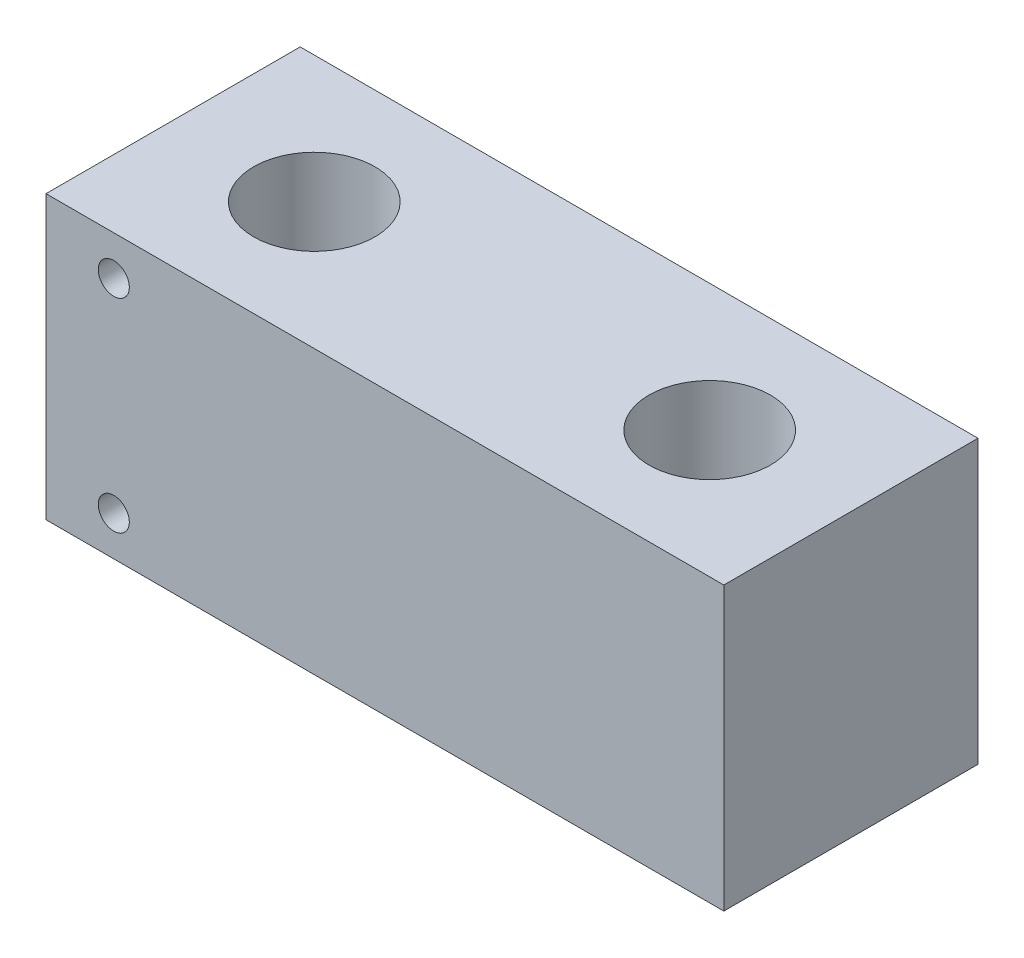
ISO-10303-21;
HEADER;
FILE_DESCRIPTION(('STEP AP214'),'2;1');
FILE_NAME('part.step','',(''),(''),'','','');
FILE_SCHEMA(('AUTOMOTIVE_DESIGN { 1 0 10303 214 1 1 1 1 }'));
ENDSEC;
DATA;
#1=APPLICATION_CONTEXT('core data for automotive mechanical design processes');
#2=APPLICATION_PROTOCOL_DEFINITION('international standard','automotive_design',2000,#1);
#3=PRODUCT_CONTEXT('',#1,'mechanical');
#4=PRODUCT('Part','Part','',(#3));
#5=PRODUCT_RELATED_PRODUCT_CATEGORY('part','',(#4));
#6=PRODUCT_DEFINITION_FORMATION('','',#4);
#7=PRODUCT_DEFINITION_CONTEXT('part definition',#1,'design');
#8=PRODUCT_DEFINITION('design','',#6,#7);
#9=PRODUCT_DEFINITION_SHAPE('','',#8);
#10=(LENGTH_UNIT() NAMED_UNIT(*) SI_UNIT(.MILLI.,.METRE.));
#11=(NAMED_UNIT(*) PLANE_ANGLE_UNIT() SI_UNIT($,.RADIAN.));
#12=(NAMED_UNIT(*) SI_UNIT($,.STERADIAN.) SOLID_ANGLE_UNIT());
#13=UNCERTAINTY_MEASURE_WITH_UNIT(LENGTH_MEASURE(1.E-05),#10,'distance_accuracy_value','');
#14=(GEOMETRIC_REPRESENTATION_CONTEXT(3) GLOBAL_UNCERTAINTY_ASSIGNED_CONTEXT((#13)) GLOBAL_UNIT_ASSIGNED_CONTEXT((#10,
#11,#12)) REPRESENTATION_CONTEXT('',''));
#15=CARTESIAN_POINT('',(0.,0.,0.));
#16=DIRECTION('',(0.,0.,1.));
#17=DIRECTION('',(1.,0.,0.));
#18=AXIS2_PLACEMENT_3D('',#15,#16,#17);
#19=CARTESIAN_POINT('',(0.,50.,0.));
#20=DIRECTION('',(0.,1.,0.));
#21=DIRECTION('',(0.,0.,1.));
#22=AXIS2_PLACEMENT_3D('',#19,#20,#21);
#23=PLANE('',#22);
#24=CARTESIAN_POINT('',(-35.,50.,0.));
#25=DIRECTION('',(0.,1.,0.));
#26=DIRECTION('',(0.,0.,1.));
#27=AXIS2_PLACEMENT_3D('',#24,#25,#26);
#28=CIRCLE('',#27,10.75);
#29=CARTESIAN_POINT('',(-35.,50.,10.75));
#30=VERTEX_POINT('',#29);
#31=EDGE_CURVE('E123',#30,#30,#28,.T.);
#32=ORIENTED_EDGE('',*,*,#31,.F.);
#33=EDGE_LOOP('',(#32));
#34=FACE_BOUND('',#33,.T.);
#35=DIRECTION('',(0.,0.,-1.));
#36=VECTOR('',#35,1.);
#37=CARTESIAN_POINT('',(60.,50.,-22.5));
#38=LINE('',#37,#36);
#39=CARTESIAN_POINT('',(60.,50.,22.5));
#40=VERTEX_POINT('',#39);
#41=CARTESIAN_POINT('',(60.,50.,-22.5));
#42=VERTEX_POINT('',#41);
#43=EDGE_CURVE('E129',#40,#42,#38,.T.);
#44=ORIENTED_EDGE('',*,*,#43,.T.);
#45=DIRECTION('',(-1.,0.,0.));
#46=VECTOR('',#45,1.);
#47=CARTESIAN_POINT('',(-60.,50.,-22.5));
#48=LINE('',#47,#46);
#49=CARTESIAN_POINT('',(-60.,50.,-22.5));
#50=VERTEX_POINT('',#49);
#51=EDGE_CURVE('E88',#42,#50,#48,.T.);
#52=ORIENTED_EDGE('',*,*,#51,.T.);
#53=DIRECTION('',(0.,0.,1.));
#54=VECTOR('',#53,1.);
#55=CARTESIAN_POINT('',(-60.,50.,-22.5));
#56=LINE('',#55,#54);
#57=CARTESIAN_POINT('',(-60.,50.,22.5));
#58=VERTEX_POINT('',#57);
#59=EDGE_CURVE('E132',#50,#58,#56,.T.);
#60=ORIENTED_EDGE('',*,*,#59,.T.);
#61=DIRECTION('',(1.,0.,0.));
#62=VECTOR('',#61,1.);
#63=CARTESIAN_POINT('',(-60.,50.,22.5));
#64=LINE('',#63,#62);
#65=EDGE_CURVE('E57',#58,#40,#64,.T.);
#66=ORIENTED_EDGE('',*,*,#65,.T.);
#67=EDGE_LOOP('',(#44,#52,#60,#66));
#68=FACE_BOUND('',#67,.T.);
#69=CARTESIAN_POINT('',(35.,50.,0.));
#70=DIRECTION('',(0.,1.,0.));
#71=DIRECTION('',(0.,0.,-1.));
#72=AXIS2_PLACEMENT_3D('',#69,#70,#71);
#73=CIRCLE('',#72,10.75);
#74=CARTESIAN_POINT('',(35.,50.,-10.75));
#75=VERTEX_POINT('',#74);
#76=EDGE_CURVE('E117',#75,#75,#73,.T.);
#77=ORIENTED_EDGE('',*,*,#76,.F.);
#78=EDGE_LOOP('',(#77));
#79=FACE_BOUND('',#78,.T.);
#80=ADVANCED_FACE('F40',(#34,#68,#79),#23,.T.);
#81=CARTESIAN_POINT('',(0.,0.,0.));
#82=DIRECTION('',(0.,1.,0.));
#83=DIRECTION('',(0.,0.,1.));
#84=AXIS2_PLACEMENT_3D('',#81,#82,#83);
#85=PLANE('',#84);
#86=DIRECTION('',(0.,0.,-1.));
#87=VECTOR('',#86,1.);
#88=CARTESIAN_POINT('',(60.,0.,-22.5));
#89=LINE('',#88,#87);
#90=CARTESIAN_POINT('',(60.,0.,22.5));
#91=VERTEX_POINT('',#90);
#92=CARTESIAN_POINT('',(60.,0.,-22.5));
#93=VERTEX_POINT('',#92);
#94=EDGE_CURVE('E126',#91,#93,#89,.T.);
#95=ORIENTED_EDGE('',*,*,#94,.F.);
#96=DIRECTION('',(1.,0.,0.));
#97=VECTOR('',#96,1.);
#98=CARTESIAN_POINT('',(-60.,0.,22.5));
#99=LINE('',#98,#97);
#100=CARTESIAN_POINT('',(-60.,0.,22.5));
#101=VERTEX_POINT('',#100);
#102=EDGE_CURVE('E81',#101,#91,#99,.T.);
#103=ORIENTED_EDGE('',*,*,#102,.F.);
#104=DIRECTION('',(0.,0.,1.));
#105=VECTOR('',#104,1.);
#106=CARTESIAN_POINT('',(-60.,0.,-22.5));
#107=LINE('',#106,#105);
#108=CARTESIAN_POINT('',(-60.,0.,-22.5));
#109=VERTEX_POINT('',#108);
#110=EDGE_CURVE('E75',#109,#101,#107,.T.);
#111=ORIENTED_EDGE('',*,*,#110,.F.);
#112=DIRECTION('',(-1.,0.,0.));
#113=VECTOR('',#112,1.);
#114=CARTESIAN_POINT('',(-60.,0.,-22.5));
#115=LINE('',#114,#113);
#116=EDGE_CURVE('E138',#93,#109,#115,.T.);
#117=ORIENTED_EDGE('',*,*,#116,.F.);
#118=EDGE_LOOP('',(#95,#103,#111,#117));
#119=FACE_BOUND('',#118,.T.);
#120=CARTESIAN_POINT('',(-35.,0.,0.));
#121=DIRECTION('',(0.,1.,0.));
#122=DIRECTION('',(0.,0.,1.));
#123=AXIS2_PLACEMENT_3D('',#120,#121,#122);
#124=CIRCLE('',#123,10.75);
#125=CARTESIAN_POINT('',(-35.,0.,10.75));
#126=VERTEX_POINT('',#125);
#127=EDGE_CURVE('E120',#126,#126,#124,.T.);
#128=ORIENTED_EDGE('',*,*,#127,.T.);
#129=EDGE_LOOP('',(#128));
#130=FACE_BOUND('',#129,.T.);
#131=CARTESIAN_POINT('',(35.,0.,0.));
#132=DIRECTION('',(0.,1.,0.));
#133=DIRECTION('',(0.,0.,-1.));
#134=AXIS2_PLACEMENT_3D('',#131,#132,#133);
#135=CIRCLE('',#134,10.75);
#136=CARTESIAN_POINT('',(35.,0.,-10.75));
#137=VERTEX_POINT('',#136);
#138=EDGE_CURVE('E116',#137,#137,#135,.T.);
#139=ORIENTED_EDGE('',*,*,#138,.T.);
#140=EDGE_LOOP('',(#139));
#141=FACE_BOUND('',#140,.T.);
#142=ADVANCED_FACE('F148',(#119,#130,#141),#85,.F.);
#143=CARTESIAN_POINT('',(60.,50.,-22.5));
#144=DIRECTION('',(-1.,0.,0.));
#145=DIRECTION('',(0.,0.,1.));
#146=AXIS2_PLACEMENT_3D('',#143,#144,#145);
#147=PLANE('',#146);
#148=ORIENTED_EDGE('',*,*,#94,.T.);
#149=DIRECTION('',(0.,-1.,0.));
#150=VECTOR('',#149,1.);
#151=CARTESIAN_POINT('',(60.,50.,-22.5));
#152=LINE('',#151,#150);
#153=EDGE_CURVE('E11',#42,#93,#152,.T.);
#154=ORIENTED_EDGE('',*,*,#153,.F.);
#155=ORIENTED_EDGE('',*,*,#43,.F.);
#156=DIRECTION('',(0.,-1.,0.));
#157=VECTOR('',#156,1.);
#158=CARTESIAN_POINT('',(60.,50.,22.5));
#159=LINE('',#158,#157);
#160=EDGE_CURVE('E135',#40,#91,#159,.T.);
#161=ORIENTED_EDGE('',*,*,#160,.T.);
#162=EDGE_LOOP('',(#148,#154,#155,#161));
#163=FACE_BOUND('',#162,.T.);
#164=ADVANCED_FACE('F42',(#163),#147,.F.);
#165=CARTESIAN_POINT('',(-60.,50.,-22.5));
#166=DIRECTION('',(0.,0.,1.));
#167=DIRECTION('',(1.,0.,0.));
#168=AXIS2_PLACEMENT_3D('',#165,#166,#167);
#169=PLANE('',#168);
#170=ORIENTED_EDGE('',*,*,#116,.T.);
#171=DIRECTION('',(0.,-1.,0.));
#172=VECTOR('',#171,1.);
#173=CARTESIAN_POINT('',(-60.,50.,-22.5));
#174=LINE('',#173,#172);
#175=EDGE_CURVE('E49',#50,#109,#174,.T.);
#176=ORIENTED_EDGE('',*,*,#175,.F.);
#177=ORIENTED_EDGE('',*,*,#51,.F.);
#178=ORIENTED_EDGE('',*,*,#153,.T.);
#179=EDGE_LOOP('',(#170,#176,#177,#178));
#180=FACE_BOUND('',#179,.T.);
#181=ADVANCED_FACE('F166',(#180),#169,.F.);
#182=CARTESIAN_POINT('',(-60.,50.,-22.5));
#183=DIRECTION('',(1.,0.,0.));
#184=DIRECTION('',(0.,0.,-1.));
#185=AXIS2_PLACEMENT_3D('',#182,#183,#184);
#186=PLANE('',#185);
#187=ORIENTED_EDGE('',*,*,#110,.T.);
#188=DIRECTION('',(0.,-1.,0.));
#189=VECTOR('',#188,1.);
#190=CARTESIAN_POINT('',(-60.,50.,22.5));
#191=LINE('',#190,#189);
#192=EDGE_CURVE('E143',#58,#101,#191,.T.);
#193=ORIENTED_EDGE('',*,*,#192,.F.);
#194=ORIENTED_EDGE('',*,*,#59,.F.);
#195=ORIENTED_EDGE('',*,*,#175,.T.);
#196=EDGE_LOOP('',(#187,#193,#194,#195));
#197=FACE_BOUND('',#196,.T.);
#198=ADVANCED_FACE('F145',(#197),#186,.F.);
#199=CARTESIAN_POINT('',(-60.,50.,22.5));
#200=DIRECTION('',(0.,0.,-1.));
#201=DIRECTION('',(-1.,0.,0.));
#202=AXIS2_PLACEMENT_3D('',#199,#200,#201);
#203=PLANE('',#202);
#204=CARTESIAN_POINT('',(-48.,43.,22.5));
#205=DIRECTION('',(0.,0.,1.));
#206=DIRECTION('',(1.,0.,0.));
#207=AXIS2_PLACEMENT_3D('',#204,#205,#206);
#208=CIRCLE('',#207,2.75);
#209=CARTESIAN_POINT('',(-45.25,43.,22.5));
#210=VERTEX_POINT('',#209);
#211=EDGE_CURVE('E106',#210,#210,#208,.T.);
#212=ORIENTED_EDGE('',*,*,#211,.F.);
#213=EDGE_LOOP('',(#212));
#214=FACE_BOUND('',#213,.T.);
#215=CARTESIAN_POINT('',(-48.,7.00000000000001,22.5));
#216=DIRECTION('',(0.,0.,1.));
#217=DIRECTION('',(1.,0.,0.));
#218=AXIS2_PLACEMENT_3D('',#215,#216,#217);
#219=CIRCLE('',#218,2.75);
#220=CARTESIAN_POINT('',(-45.25,7.00000000000001,22.5));
#221=VERTEX_POINT('',#220);
#222=EDGE_CURVE('E105',#221,#221,#219,.T.);
#223=ORIENTED_EDGE('',*,*,#222,.F.);
#224=EDGE_LOOP('',(#223));
#225=FACE_BOUND('',#224,.T.);
#226=ORIENTED_EDGE('',*,*,#102,.T.);
#227=ORIENTED_EDGE('',*,*,#160,.F.);
#228=ORIENTED_EDGE('',*,*,#65,.F.);
#229=ORIENTED_EDGE('',*,*,#192,.T.);
#230=EDGE_LOOP('',(#226,#227,#228,#229));
#231=FACE_BOUND('',#230,.T.);
#232=ADVANCED_FACE('F153',(#214,#225,#231),#203,.F.);
#233=CARTESIAN_POINT('',(-35.,50.,0.));
#234=DIRECTION('',(0.,-1.,0.));
#235=DIRECTION('',(0.,0.,-1.));
#236=AXIS2_PLACEMENT_3D('',#233,#234,#235);
#237=CYLINDRICAL_SURFACE('',#236,10.75);
#238=ORIENTED_EDGE('',*,*,#31,.T.);
#239=EDGE_LOOP('',(#238));
#240=FACE_BOUND('',#239,.T.);
#241=ORIENTED_EDGE('',*,*,#127,.F.);
#242=EDGE_LOOP('',(#241));
#243=FACE_BOUND('',#242,.T.);
#244=ADVANCED_FACE('F155',(#240,#243),#237,.F.);
#245=CARTESIAN_POINT('',(35.,50.,0.));
#246=DIRECTION('',(0.,-1.,0.));
#247=DIRECTION('',(0.,0.,-1.));
#248=AXIS2_PLACEMENT_3D('',#245,#246,#247);
#249=CYLINDRICAL_SURFACE('',#248,10.75);
#250=ORIENTED_EDGE('',*,*,#76,.T.);
#251=EDGE_LOOP('',(#250));
#252=FACE_BOUND('',#251,.T.);
#253=ORIENTED_EDGE('',*,*,#138,.F.);
#254=EDGE_LOOP('',(#253));
#255=FACE_BOUND('',#254,.T.);
#256=ADVANCED_FACE('F162',(#252,#255),#249,.F.);
#257=CARTESIAN_POINT('',(-48.,7.00000000000001,7.5));
#258=DIRECTION('',(0.,0.,1.));
#259=DIRECTION('',(1.,0.,0.));
#260=AXIS2_PLACEMENT_3D('',#257,#258,#259);
#261=CONICAL_SURFACE('',#260,2.75,1.02974425867665);
#262=CARTESIAN_POINT('',(-48.,7.00000000000001,5.84763329767421));
#263=VERTEX_POINT('',#262);
#264=VERTEX_LOOP('',#263);
#265=FACE_BOUND('',#264,.T.);
#266=CARTESIAN_POINT('',(-48.,7.00000000000001,7.5));
#267=DIRECTION('',(0.,0.,1.));
#268=DIRECTION('',(1.,0.,0.));
#269=AXIS2_PLACEMENT_3D('',#266,#267,#268);
#270=CIRCLE('',#269,2.75);
#271=CARTESIAN_POINT('',(-45.25,7.00000000000001,7.5));
#272=VERTEX_POINT('',#271);
#273=EDGE_CURVE('E109',#272,#272,#270,.T.);
#274=ORIENTED_EDGE('',*,*,#273,.T.);
#275=EDGE_LOOP('',(#274));
#276=FACE_BOUND('',#275,.T.);
#277=ADVANCED_FACE('F181',(#265,#276),#261,.F.);
#278=CARTESIAN_POINT('',(-48.,7.00000000000001,22.5));
#279=DIRECTION('',(0.,0.,1.));
#280=DIRECTION('',(1.,0.,0.));
#281=AXIS2_PLACEMENT_3D('',#278,#279,#280);
#282=CYLINDRICAL_SURFACE('',#281,2.75);
#283=ORIENTED_EDGE('',*,*,#273,.F.);
#284=EDGE_LOOP('',(#283));
#285=FACE_BOUND('',#284,.T.);
#286=ORIENTED_EDGE('',*,*,#222,.T.);
#287=EDGE_LOOP('',(#286));
#288=FACE_BOUND('',#287,.T.);
#289=ADVANCED_FACE('F99',(#285,#288),#282,.F.);
#290=CARTESIAN_POINT('',(-48.,43.,7.5));
#291=DIRECTION('',(0.,0.,1.));
#292=DIRECTION('',(1.,0.,0.));
#293=AXIS2_PLACEMENT_3D('',#290,#291,#292);
#294=CONICAL_SURFACE('',#293,2.75,1.02974425867665);
#295=CARTESIAN_POINT('',(-48.,43.,5.84763329767421));
#296=VERTEX_POINT('',#295);
#297=VERTEX_LOOP('',#296);
#298=FACE_BOUND('',#297,.T.);
#299=CARTESIAN_POINT('',(-48.,43.,7.5));
#300=DIRECTION('',(0.,0.,1.));
#301=DIRECTION('',(1.,0.,0.));
#302=AXIS2_PLACEMENT_3D('',#299,#300,#301);
#303=CIRCLE('',#302,2.75);
#304=CARTESIAN_POINT('',(-45.25,43.,7.5));
#305=VERTEX_POINT('',#304);
#306=EDGE_CURVE('E103',#305,#305,#303,.T.);
#307=ORIENTED_EDGE('',*,*,#306,.T.);
#308=EDGE_LOOP('',(#307));
#309=FACE_BOUND('',#308,.T.);
#310=ADVANCED_FACE('F95',(#298,#309),#294,.F.);
#311=CARTESIAN_POINT('',(-48.,43.,22.5));
#312=DIRECTION('',(0.,0.,1.));
#313=DIRECTION('',(1.,0.,0.));
#314=AXIS2_PLACEMENT_3D('',#311,#312,#313);
#315=CYLINDRICAL_SURFACE('',#314,2.75);
#316=ORIENTED_EDGE('',*,*,#306,.F.);
#317=EDGE_LOOP('',(#316));
#318=FACE_BOUND('',#317,.T.);
#319=ORIENTED_EDGE('',*,*,#211,.T.);
#320=EDGE_LOOP('',(#319));
#321=FACE_BOUND('',#320,.T.);
#322=ADVANCED_FACE('F98',(#318,#321),#315,.F.);
#323=CLOSED_SHELL('',(#80,#142,#164,#181,#198,#232,#244,#256,#277,#289,#310,#322));
#324=MANIFOLD_SOLID_BREP('B2',#323);
#325=ADVANCED_BREP_SHAPE_REPRESENTATION('',(#18,#324),#14);
#326=SHAPE_DEFINITION_REPRESENTATION(#9,#325);
ENDSEC;
END-ISO-10303-21;
